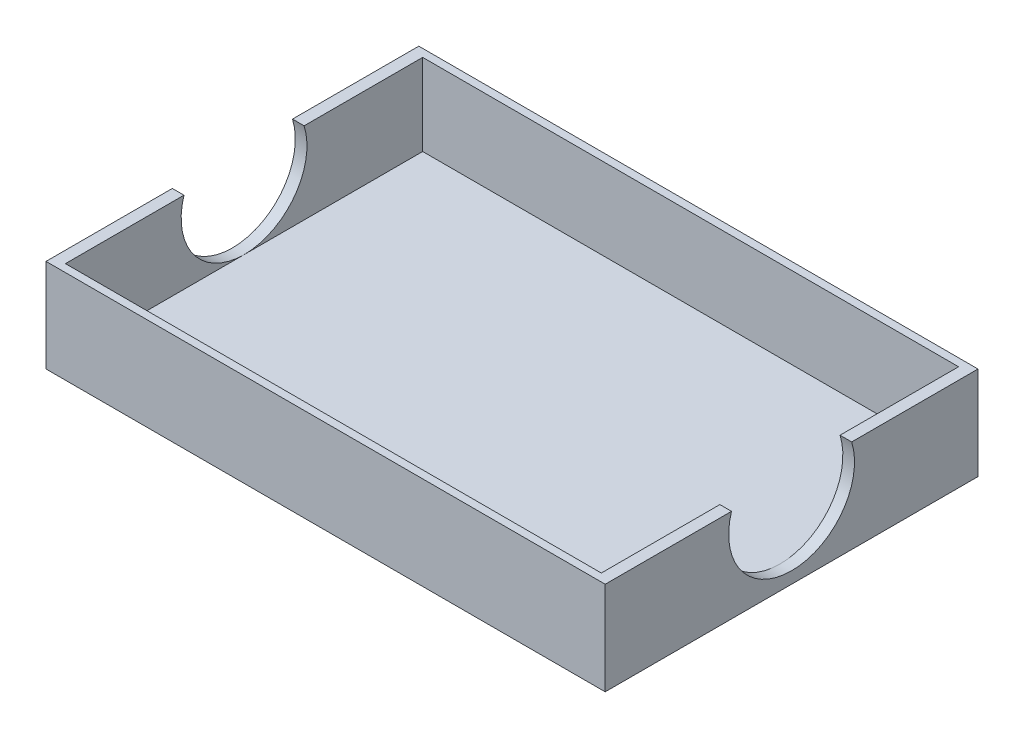
ISO-10303-21;
HEADER;
FILE_DESCRIPTION(('STEP AP214'),'2;1');
FILE_NAME('part.step','',(''),(''),'','','');
FILE_SCHEMA(('AUTOMOTIVE_DESIGN { 1 0 10303 214 1 1 1 1 }'));
ENDSEC;
DATA;
#1=APPLICATION_CONTEXT('core data for automotive mechanical design processes');
#2=APPLICATION_PROTOCOL_DEFINITION('international standard','automotive_design',2000,#1);
#3=PRODUCT_CONTEXT('',#1,'mechanical');
#4=PRODUCT('Part','Part','',(#3));
#5=PRODUCT_RELATED_PRODUCT_CATEGORY('part','',(#4));
#6=PRODUCT_DEFINITION_FORMATION('','',#4);
#7=PRODUCT_DEFINITION_CONTEXT('part definition',#1,'design');
#8=PRODUCT_DEFINITION('design','',#6,#7);
#9=PRODUCT_DEFINITION_SHAPE('','',#8);
#10=(LENGTH_UNIT() NAMED_UNIT(*) SI_UNIT(.MILLI.,.METRE.));
#11=(NAMED_UNIT(*) PLANE_ANGLE_UNIT() SI_UNIT($,.RADIAN.));
#12=(NAMED_UNIT(*) SI_UNIT($,.STERADIAN.) SOLID_ANGLE_UNIT());
#13=UNCERTAINTY_MEASURE_WITH_UNIT(LENGTH_MEASURE(1.E-05),#10,'distance_accuracy_value','');
#14=(GEOMETRIC_REPRESENTATION_CONTEXT(3) GLOBAL_UNCERTAINTY_ASSIGNED_CONTEXT((#13)) GLOBAL_UNIT_ASSIGNED_CONTEXT((#10,
#11,#12)) REPRESENTATION_CONTEXT('',''));
#15=CARTESIAN_POINT('',(0.,0.,0.));
#16=DIRECTION('',(0.,0.,1.));
#17=DIRECTION('',(1.,0.,0.));
#18=AXIS2_PLACEMENT_3D('',#15,#16,#17);
#19=CARTESIAN_POINT('',(0.,20.,0.));
#20=DIRECTION('',(0.,-1.,0.));
#21=DIRECTION('',(0.,0.,-1.));
#22=AXIS2_PLACEMENT_3D('',#19,#20,#21);
#23=PLANE('',#22);
#24=DIRECTION('',(0.,0.,-1.));
#25=VECTOR('',#24,1.);
#26=CARTESIAN_POINT('',(60.,20.,40.));
#27=LINE('',#26,#25);
#28=CARTESIAN_POINT('',(60.,20.,40.));
#29=VERTEX_POINT('',#28);
#30=CARTESIAN_POINT('',(60.,20.,12.8937969582276));
#31=VERTEX_POINT('',#30);
#32=EDGE_CURVE('E145',#29,#31,#27,.T.);
#33=ORIENTED_EDGE('',*,*,#32,.T.);
#34=DIRECTION('',(-1.,0.,0.));
#35=VECTOR('',#34,1.);
#36=CARTESIAN_POINT('',(60.,20.,12.8937969582276));
#37=LINE('',#36,#35);
#38=CARTESIAN_POINT('',(57.5,20.,12.8937969582276));
#39=VERTEX_POINT('',#38);
#40=EDGE_CURVE('E128',#31,#39,#37,.T.);
#41=ORIENTED_EDGE('',*,*,#40,.T.);
#42=DIRECTION('',(0.,0.,-1.));
#43=VECTOR('',#42,1.);
#44=CARTESIAN_POINT('',(57.5,20.,-38.3333333333333));
#45=LINE('',#44,#43);
#46=CARTESIAN_POINT('',(57.5,20.,38.3333333333333));
#47=VERTEX_POINT('',#46);
#48=EDGE_CURVE('E234',#47,#39,#45,.T.);
#49=ORIENTED_EDGE('',*,*,#48,.F.);
#50=DIRECTION('',(1.,0.,0.));
#51=VECTOR('',#50,1.);
#52=CARTESIAN_POINT('',(57.5,20.,38.3333333333333));
#53=LINE('',#52,#51);
#54=CARTESIAN_POINT('',(-57.5,20.,38.3333333333333));
#55=VERTEX_POINT('',#54);
#56=EDGE_CURVE('E232',#55,#47,#53,.T.);
#57=ORIENTED_EDGE('',*,*,#56,.F.);
#58=DIRECTION('',(0.,0.,1.));
#59=VECTOR('',#58,1.);
#60=CARTESIAN_POINT('',(-57.5,20.,-38.3333333333333));
#61=LINE('',#60,#59);
#62=CARTESIAN_POINT('',(-57.5,20.,12.8937969582276));
#63=VERTEX_POINT('',#62);
#64=EDGE_CURVE('E214',#63,#55,#61,.T.);
#65=ORIENTED_EDGE('',*,*,#64,.F.);
#66=CARTESIAN_POINT('',(-60.,20.,12.8937969582276));
#67=VERTEX_POINT('',#66);
#68=EDGE_CURVE('E140',#63,#67,#37,.T.);
#69=ORIENTED_EDGE('',*,*,#68,.T.);
#70=DIRECTION('',(0.,0.,1.));
#71=VECTOR('',#70,1.);
#72=CARTESIAN_POINT('',(-60.,20.,40.));
#73=LINE('',#72,#71);
#74=CARTESIAN_POINT('',(-60.,20.,40.));
#75=VERTEX_POINT('',#74);
#76=EDGE_CURVE('E155',#67,#75,#73,.T.);
#77=ORIENTED_EDGE('',*,*,#76,.T.);
#78=DIRECTION('',(1.,0.,0.));
#79=VECTOR('',#78,1.);
#80=CARTESIAN_POINT('',(-60.,20.,40.));
#81=LINE('',#80,#79);
#82=EDGE_CURVE('E151',#75,#29,#81,.T.);
#83=ORIENTED_EDGE('',*,*,#82,.T.);
#84=EDGE_LOOP('',(#33,#41,#49,#57,#65,#69,#77,#83));
#85=FACE_BOUND('',#84,.T.);
#86=ADVANCED_FACE('F35',(#85),#23,.F.);
#87=CARTESIAN_POINT('',(-57.5,20.,-38.3333333333333));
#88=DIRECTION('',(1.,0.,0.));
#89=DIRECTION('',(0.,0.,-1.));
#90=AXIS2_PLACEMENT_3D('',#87,#88,#89);
#91=PLANE('',#90);
#92=CARTESIAN_POINT('',(-57.5,16.,0.));
#93=DIRECTION('',(1.,0.,0.));
#94=DIRECTION('',(0.,0.,-1.));
#95=AXIS2_PLACEMENT_3D('',#92,#93,#94);
#96=CIRCLE('',#95,13.5);
#97=CARTESIAN_POINT('',(-57.5,2.5,0.));
#98=VERTEX_POINT('',#97);
#99=EDGE_CURVE('E58',#63,#98,#96,.T.);
#100=ORIENTED_EDGE('',*,*,#99,.F.);
#101=ORIENTED_EDGE('',*,*,#64,.T.);
#102=DIRECTION('',(0.,-1.,0.));
#103=VECTOR('',#102,1.);
#104=CARTESIAN_POINT('',(-57.5,20.,38.3333333333333));
#105=LINE('',#104,#103);
#106=CARTESIAN_POINT('',(-57.5,2.5,38.3333333333333));
#107=VERTEX_POINT('',#106);
#108=EDGE_CURVE('E159',#55,#107,#105,.T.);
#109=ORIENTED_EDGE('',*,*,#108,.T.);
#110=DIRECTION('',(0.,0.,1.));
#111=VECTOR('',#110,1.);
#112=CARTESIAN_POINT('',(-57.5,2.5,0.));
#113=LINE('',#112,#111);
#114=EDGE_CURVE('E217',#98,#107,#113,.T.);
#115=ORIENTED_EDGE('',*,*,#114,.F.);
#116=EDGE_LOOP('',(#100,#101,#109,#115));
#117=FACE_BOUND('',#116,.T.);
#118=ADVANCED_FACE('F251',(#117),#91,.T.);
#119=CARTESIAN_POINT('',(57.5,20.,-38.3333333333333));
#120=DIRECTION('',(-1.,0.,0.));
#121=DIRECTION('',(0.,0.,1.));
#122=AXIS2_PLACEMENT_3D('',#119,#120,#121);
#123=PLANE('',#122);
#124=CARTESIAN_POINT('',(57.5,16.,0.));
#125=DIRECTION('',(-1.,0.,0.));
#126=DIRECTION('',(0.,0.,1.));
#127=AXIS2_PLACEMENT_3D('',#124,#125,#126);
#128=CIRCLE('',#127,13.5);
#129=CARTESIAN_POINT('',(57.5,20.,-12.8937969582276));
#130=VERTEX_POINT('',#129);
#131=CARTESIAN_POINT('',(57.5,2.5,0.));
#132=VERTEX_POINT('',#131);
#133=EDGE_CURVE('E50',#130,#132,#128,.T.);
#134=ORIENTED_EDGE('',*,*,#133,.F.);
#135=CARTESIAN_POINT('',(57.5,20.,-38.3333333333333));
#136=VERTEX_POINT('',#135);
#137=EDGE_CURVE('E202',#130,#136,#45,.T.);
#138=ORIENTED_EDGE('',*,*,#137,.T.);
#139=DIRECTION('',(0.,-1.,0.));
#140=VECTOR('',#139,1.);
#141=CARTESIAN_POINT('',(57.5,20.,-38.3333333333333));
#142=LINE('',#141,#140);
#143=CARTESIAN_POINT('',(57.5,2.5,-38.3333333333333));
#144=VERTEX_POINT('',#143);
#145=EDGE_CURVE('E240',#136,#144,#142,.T.);
#146=ORIENTED_EDGE('',*,*,#145,.T.);
#147=DIRECTION('',(0.,0.,1.));
#148=VECTOR('',#147,1.);
#149=CARTESIAN_POINT('',(57.5,2.5,0.));
#150=LINE('',#149,#148);
#151=EDGE_CURVE('E227',#144,#132,#150,.T.);
#152=ORIENTED_EDGE('',*,*,#151,.T.);
#153=EDGE_LOOP('',(#134,#138,#146,#152));
#154=FACE_BOUND('',#153,.T.);
#155=ADVANCED_FACE('F260',(#154),#123,.T.);
#156=CARTESIAN_POINT('',(-60.,20.,-40.));
#157=VERTEX_POINT('',#156);
#158=CARTESIAN_POINT('',(-60.,20.,-12.8937969582276));
#159=VERTEX_POINT('',#158);
#160=EDGE_CURVE('E162',#157,#159,#73,.T.);
#161=ORIENTED_EDGE('',*,*,#160,.T.);
#162=DIRECTION('',(-1.,0.,0.));
#163=VECTOR('',#162,1.);
#164=CARTESIAN_POINT('',(60.,20.,-12.8937969582276));
#165=LINE('',#164,#163);
#166=CARTESIAN_POINT('',(-57.5,20.,-12.8937969582276));
#167=VERTEX_POINT('',#166);
#168=EDGE_CURVE('E138',#159,#167,#165,.F.);
#169=ORIENTED_EDGE('',*,*,#168,.T.);
#170=CARTESIAN_POINT('',(-57.5,20.,-38.3333333333333));
#171=VERTEX_POINT('',#170);
#172=EDGE_CURVE('E230',#171,#167,#61,.T.);
#173=ORIENTED_EDGE('',*,*,#172,.F.);
#174=DIRECTION('',(-1.,0.,0.));
#175=VECTOR('',#174,1.);
#176=CARTESIAN_POINT('',(57.5,20.,-38.3333333333333));
#177=LINE('',#176,#175);
#178=EDGE_CURVE('E236',#136,#171,#177,.T.);
#179=ORIENTED_EDGE('',*,*,#178,.F.);
#180=ORIENTED_EDGE('',*,*,#137,.F.);
#181=CARTESIAN_POINT('',(60.,20.,-12.8937969582276));
#182=VERTEX_POINT('',#181);
#183=EDGE_CURVE('E200',#130,#182,#165,.F.);
#184=ORIENTED_EDGE('',*,*,#183,.T.);
#185=CARTESIAN_POINT('',(60.,20.,-40.));
#186=VERTEX_POINT('',#185);
#187=EDGE_CURVE('E147',#182,#186,#27,.T.);
#188=ORIENTED_EDGE('',*,*,#187,.T.);
#189=DIRECTION('',(-1.,0.,0.));
#190=VECTOR('',#189,1.);
#191=CARTESIAN_POINT('',(-60.,20.,-40.));
#192=LINE('',#191,#190);
#193=EDGE_CURVE('E153',#186,#157,#192,.T.);
#194=ORIENTED_EDGE('',*,*,#193,.T.);
#195=EDGE_LOOP('',(#161,#169,#173,#179,#180,#184,#188,#194));
#196=FACE_BOUND('',#195,.T.);
#197=ADVANCED_FACE('F197',(#196),#23,.F.);
#198=CARTESIAN_POINT('',(0.,0.,0.));
#199=DIRECTION('',(0.,-1.,0.));
#200=DIRECTION('',(0.,0.,-1.));
#201=AXIS2_PLACEMENT_3D('',#198,#199,#200);
#202=PLANE('',#201);
#203=DIRECTION('',(0.,0.,-1.));
#204=VECTOR('',#203,1.);
#205=CARTESIAN_POINT('',(60.,0.,40.));
#206=LINE('',#205,#204);
#207=CARTESIAN_POINT('',(60.,0.,40.));
#208=VERTEX_POINT('',#207);
#209=CARTESIAN_POINT('',(60.,0.,-40.));
#210=VERTEX_POINT('',#209);
#211=EDGE_CURVE('E167',#208,#210,#206,.T.);
#212=ORIENTED_EDGE('',*,*,#211,.F.);
#213=DIRECTION('',(1.,0.,0.));
#214=VECTOR('',#213,1.);
#215=CARTESIAN_POINT('',(-60.,0.,40.));
#216=LINE('',#215,#214);
#217=CARTESIAN_POINT('',(-60.,0.,40.));
#218=VERTEX_POINT('',#217);
#219=EDGE_CURVE('E157',#218,#208,#216,.T.);
#220=ORIENTED_EDGE('',*,*,#219,.F.);
#221=DIRECTION('',(0.,0.,1.));
#222=VECTOR('',#221,1.);
#223=CARTESIAN_POINT('',(-60.,0.,40.));
#224=LINE('',#223,#222);
#225=CARTESIAN_POINT('',(-60.,0.,-40.));
#226=VERTEX_POINT('',#225);
#227=EDGE_CURVE('E172',#226,#218,#224,.T.);
#228=ORIENTED_EDGE('',*,*,#227,.F.);
#229=DIRECTION('',(-1.,0.,0.));
#230=VECTOR('',#229,1.);
#231=CARTESIAN_POINT('',(-60.,0.,-40.));
#232=LINE('',#231,#230);
#233=EDGE_CURVE('E170',#210,#226,#232,.T.);
#234=ORIENTED_EDGE('',*,*,#233,.F.);
#235=EDGE_LOOP('',(#212,#220,#228,#234));
#236=FACE_BOUND('',#235,.T.);
#237=ADVANCED_FACE('F192',(#236),#202,.T.);
#238=CARTESIAN_POINT('',(60.,20.,40.));
#239=DIRECTION('',(-1.,0.,0.));
#240=DIRECTION('',(0.,0.,1.));
#241=AXIS2_PLACEMENT_3D('',#238,#239,#240);
#242=PLANE('',#241);
#243=ORIENTED_EDGE('',*,*,#187,.F.);
#244=CARTESIAN_POINT('',(60.,16.,0.));
#245=DIRECTION('',(-1.,0.,0.));
#246=DIRECTION('',(0.,0.,1.));
#247=AXIS2_PLACEMENT_3D('',#244,#245,#246);
#248=CIRCLE('',#247,13.5);
#249=EDGE_CURVE('E131',#182,#31,#248,.T.);
#250=ORIENTED_EDGE('',*,*,#249,.T.);
#251=ORIENTED_EDGE('',*,*,#32,.F.);
#252=DIRECTION('',(0.,-1.,0.));
#253=VECTOR('',#252,1.);
#254=CARTESIAN_POINT('',(60.,20.,40.));
#255=LINE('',#254,#253);
#256=EDGE_CURVE('E166',#29,#208,#255,.T.);
#257=ORIENTED_EDGE('',*,*,#256,.T.);
#258=ORIENTED_EDGE('',*,*,#211,.T.);
#259=DIRECTION('',(0.,-1.,0.));
#260=VECTOR('',#259,1.);
#261=CARTESIAN_POINT('',(60.,20.,-40.));
#262=LINE('',#261,#260);
#263=EDGE_CURVE('E11',#186,#210,#262,.T.);
#264=ORIENTED_EDGE('',*,*,#263,.F.);
#265=EDGE_LOOP('',(#243,#250,#251,#257,#258,#264));
#266=FACE_BOUND('',#265,.T.);
#267=ADVANCED_FACE('F37',(#266),#242,.F.);
#268=CARTESIAN_POINT('',(-60.,20.,-40.));
#269=DIRECTION('',(0.,0.,1.));
#270=DIRECTION('',(1.,0.,0.));
#271=AXIS2_PLACEMENT_3D('',#268,#269,#270);
#272=PLANE('',#271);
#273=ORIENTED_EDGE('',*,*,#233,.T.);
#274=DIRECTION('',(0.,-1.,0.));
#275=VECTOR('',#274,1.);
#276=CARTESIAN_POINT('',(-60.,20.,-40.));
#277=LINE('',#276,#275);
#278=EDGE_CURVE('E43',#157,#226,#277,.T.);
#279=ORIENTED_EDGE('',*,*,#278,.F.);
#280=ORIENTED_EDGE('',*,*,#193,.F.);
#281=ORIENTED_EDGE('',*,*,#263,.T.);
#282=EDGE_LOOP('',(#273,#279,#280,#281));
#283=FACE_BOUND('',#282,.T.);
#284=ADVANCED_FACE('F195',(#283),#272,.F.);
#285=CARTESIAN_POINT('',(-60.,20.,40.));
#286=DIRECTION('',(1.,0.,0.));
#287=DIRECTION('',(0.,0.,-1.));
#288=AXIS2_PLACEMENT_3D('',#285,#286,#287);
#289=PLANE('',#288);
#290=ORIENTED_EDGE('',*,*,#76,.F.);
#291=CARTESIAN_POINT('',(-60.,16.,0.));
#292=DIRECTION('',(-1.,0.,0.));
#293=DIRECTION('',(0.,0.,1.));
#294=AXIS2_PLACEMENT_3D('',#291,#292,#293);
#295=CIRCLE('',#294,13.5);
#296=EDGE_CURVE('E148',#159,#67,#295,.T.);
#297=ORIENTED_EDGE('',*,*,#296,.F.);
#298=ORIENTED_EDGE('',*,*,#160,.F.);
#299=ORIENTED_EDGE('',*,*,#278,.T.);
#300=ORIENTED_EDGE('',*,*,#227,.T.);
#301=DIRECTION('',(0.,-1.,0.));
#302=VECTOR('',#301,1.);
#303=CARTESIAN_POINT('',(-60.,20.,40.));
#304=LINE('',#303,#302);
#305=EDGE_CURVE('E176',#75,#218,#304,.T.);
#306=ORIENTED_EDGE('',*,*,#305,.F.);
#307=EDGE_LOOP('',(#290,#297,#298,#299,#300,#306));
#308=FACE_BOUND('',#307,.T.);
#309=ADVANCED_FACE('F184',(#308),#289,.F.);
#310=CARTESIAN_POINT('',(-60.,20.,40.));
#311=DIRECTION('',(0.,0.,-1.));
#312=DIRECTION('',(-1.,0.,0.));
#313=AXIS2_PLACEMENT_3D('',#310,#311,#312);
#314=PLANE('',#313);
#315=ORIENTED_EDGE('',*,*,#219,.T.);
#316=ORIENTED_EDGE('',*,*,#256,.F.);
#317=ORIENTED_EDGE('',*,*,#82,.F.);
#318=ORIENTED_EDGE('',*,*,#305,.T.);
#319=EDGE_LOOP('',(#315,#316,#317,#318));
#320=FACE_BOUND('',#319,.T.);
#321=ADVANCED_FACE('F194',(#320),#314,.F.);
#322=EDGE_CURVE('E205',#98,#167,#96,.T.);
#323=ORIENTED_EDGE('',*,*,#322,.F.);
#324=CARTESIAN_POINT('',(-57.5,2.5,-38.3333333333333));
#325=VERTEX_POINT('',#324);
#326=EDGE_CURVE('E220',#325,#98,#113,.T.);
#327=ORIENTED_EDGE('',*,*,#326,.F.);
#328=DIRECTION('',(0.,-1.,0.));
#329=VECTOR('',#328,1.);
#330=CARTESIAN_POINT('',(-57.5,20.,-38.3333333333333));
#331=LINE('',#330,#329);
#332=EDGE_CURVE('E238',#171,#325,#331,.T.);
#333=ORIENTED_EDGE('',*,*,#332,.F.);
#334=ORIENTED_EDGE('',*,*,#172,.T.);
#335=EDGE_LOOP('',(#323,#327,#333,#334));
#336=FACE_BOUND('',#335,.T.);
#337=ADVANCED_FACE('F266',(#336),#91,.T.);
#338=CARTESIAN_POINT('',(57.5,20.,38.3333333333333));
#339=DIRECTION('',(0.,0.,-1.));
#340=DIRECTION('',(-1.,0.,0.));
#341=AXIS2_PLACEMENT_3D('',#338,#339,#340);
#342=PLANE('',#341);
#343=DIRECTION('',(-1.,0.,0.));
#344=VECTOR('',#343,1.);
#345=CARTESIAN_POINT('',(0.,2.5,38.3333333333333));
#346=LINE('',#345,#344);
#347=CARTESIAN_POINT('',(57.5,2.5,38.3333333333333));
#348=VERTEX_POINT('',#347);
#349=EDGE_CURVE('E223',#348,#107,#346,.T.);
#350=ORIENTED_EDGE('',*,*,#349,.T.);
#351=ORIENTED_EDGE('',*,*,#108,.F.);
#352=ORIENTED_EDGE('',*,*,#56,.T.);
#353=DIRECTION('',(0.,-1.,0.));
#354=VECTOR('',#353,1.);
#355=CARTESIAN_POINT('',(57.5,20.,38.3333333333333));
#356=LINE('',#355,#354);
#357=EDGE_CURVE('E242',#47,#348,#356,.T.);
#358=ORIENTED_EDGE('',*,*,#357,.T.);
#359=EDGE_LOOP('',(#350,#351,#352,#358));
#360=FACE_BOUND('',#359,.T.);
#361=ADVANCED_FACE('F252',(#360),#342,.T.);
#362=EDGE_CURVE('E133',#132,#39,#128,.T.);
#363=ORIENTED_EDGE('',*,*,#362,.F.);
#364=EDGE_CURVE('E226',#132,#348,#150,.T.);
#365=ORIENTED_EDGE('',*,*,#364,.T.);
#366=ORIENTED_EDGE('',*,*,#357,.F.);
#367=ORIENTED_EDGE('',*,*,#48,.T.);
#368=EDGE_LOOP('',(#363,#365,#366,#367));
#369=FACE_BOUND('',#368,.T.);
#370=ADVANCED_FACE('F254',(#369),#123,.T.);
#371=CARTESIAN_POINT('',(57.5,20.,-38.3333333333333));
#372=DIRECTION('',(0.,0.,1.));
#373=DIRECTION('',(1.,0.,0.));
#374=AXIS2_PLACEMENT_3D('',#371,#372,#373);
#375=PLANE('',#374);
#376=DIRECTION('',(-1.,0.,0.));
#377=VECTOR('',#376,1.);
#378=CARTESIAN_POINT('',(0.,2.5,-38.3333333333333));
#379=LINE('',#378,#377);
#380=EDGE_CURVE('E215',#144,#325,#379,.T.);
#381=ORIENTED_EDGE('',*,*,#380,.F.);
#382=ORIENTED_EDGE('',*,*,#145,.F.);
#383=ORIENTED_EDGE('',*,*,#178,.T.);
#384=ORIENTED_EDGE('',*,*,#332,.T.);
#385=EDGE_LOOP('',(#381,#382,#383,#384));
#386=FACE_BOUND('',#385,.T.);
#387=ADVANCED_FACE('F263',(#386),#375,.T.);
#388=CARTESIAN_POINT('',(0.,2.5,0.));
#389=DIRECTION('',(0.,1.,0.));
#390=DIRECTION('',(0.,0.,1.));
#391=AXIS2_PLACEMENT_3D('',#388,#389,#390);
#392=PLANE('',#391);
#393=ORIENTED_EDGE('',*,*,#326,.T.);
#394=ORIENTED_EDGE('',*,*,#114,.T.);
#395=ORIENTED_EDGE('',*,*,#349,.F.);
#396=ORIENTED_EDGE('',*,*,#364,.F.);
#397=ORIENTED_EDGE('',*,*,#151,.F.);
#398=ORIENTED_EDGE('',*,*,#380,.T.);
#399=EDGE_LOOP('',(#393,#394,#395,#396,#397,#398));
#400=FACE_BOUND('',#399,.T.);
#401=ADVANCED_FACE('F258',(#400),#392,.T.);
#402=CARTESIAN_POINT('',(60.,16.,0.));
#403=DIRECTION('',(-1.,0.,0.));
#404=DIRECTION('',(0.,0.,1.));
#405=AXIS2_PLACEMENT_3D('',#402,#403,#404);
#406=CYLINDRICAL_SURFACE('',#405,13.5);
#407=ORIENTED_EDGE('',*,*,#133,.T.);
#408=ORIENTED_EDGE('',*,*,#362,.T.);
#409=ORIENTED_EDGE('',*,*,#40,.F.);
#410=ORIENTED_EDGE('',*,*,#249,.F.);
#411=ORIENTED_EDGE('',*,*,#183,.F.);
#412=EDGE_LOOP('',(#407,#408,#409,#410,#411));
#413=FACE_BOUND('',#412,.T.);
#414=ADVANCED_FACE('F130',(#413),#406,.F.);
#415=ORIENTED_EDGE('',*,*,#99,.T.);
#416=ORIENTED_EDGE('',*,*,#322,.T.);
#417=ORIENTED_EDGE('',*,*,#168,.F.);
#418=ORIENTED_EDGE('',*,*,#296,.T.);
#419=ORIENTED_EDGE('',*,*,#68,.F.);
#420=EDGE_LOOP('',(#415,#416,#417,#418,#419));
#421=FACE_BOUND('',#420,.T.);
#422=ADVANCED_FACE('F211',(#421),#406,.F.);
#423=CLOSED_SHELL('',(#86,#118,#155,#197,#237,#267,#284,#309,#321,#337,#361,#370,#387,#401,#414,#422));
#424=MANIFOLD_SOLID_BREP('B2',#423);
#425=ADVANCED_BREP_SHAPE_REPRESENTATION('',(#18,#424),#14);
#426=SHAPE_DEFINITION_REPRESENTATION(#9,#425);
ENDSEC;
END-ISO-10303-21;
